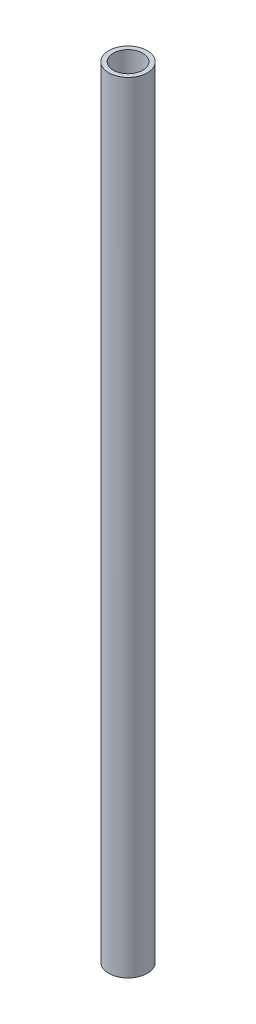
ISO-10303-21;
HEADER;
FILE_DESCRIPTION(('STEP AP214'),'2;1');
FILE_NAME('part.step','',(''),(''),'','','');
FILE_SCHEMA(('AUTOMOTIVE_DESIGN { 1 0 10303 214 1 1 1 1 }'));
ENDSEC;
DATA;
#1=APPLICATION_CONTEXT('core data for automotive mechanical design processes');
#2=APPLICATION_PROTOCOL_DEFINITION('international standard','automotive_design',2000,#1);
#3=PRODUCT_CONTEXT('',#1,'mechanical');
#4=PRODUCT('Part','Part','',(#3));
#5=PRODUCT_RELATED_PRODUCT_CATEGORY('part','',(#4));
#6=PRODUCT_DEFINITION_FORMATION('','',#4);
#7=PRODUCT_DEFINITION_CONTEXT('part definition',#1,'design');
#8=PRODUCT_DEFINITION('design','',#6,#7);
#9=PRODUCT_DEFINITION_SHAPE('','',#8);
#10=(LENGTH_UNIT() NAMED_UNIT(*) SI_UNIT(.MILLI.,.METRE.));
#11=(NAMED_UNIT(*) PLANE_ANGLE_UNIT() SI_UNIT($,.RADIAN.));
#12=(NAMED_UNIT(*) SI_UNIT($,.STERADIAN.) SOLID_ANGLE_UNIT());
#13=UNCERTAINTY_MEASURE_WITH_UNIT(LENGTH_MEASURE(1.E-05),#10,'distance_accuracy_value','');
#14=(GEOMETRIC_REPRESENTATION_CONTEXT(3) GLOBAL_UNCERTAINTY_ASSIGNED_CONTEXT((#13)) GLOBAL_UNIT_ASSIGNED_CONTEXT((#10,
#11,#12)) REPRESENTATION_CONTEXT('',''));
#15=CARTESIAN_POINT('',(0.,0.,0.));
#16=DIRECTION('',(0.,0.,1.));
#17=DIRECTION('',(1.,0.,0.));
#18=AXIS2_PLACEMENT_3D('',#15,#16,#17);
#19=CARTESIAN_POINT('',(-1.11286674320255E-13,128.579995791175,1.62832247685429E-13));
#20=DIRECTION('',(0.,-1.,0.));
#21=DIRECTION('',(0.589150160189619,0.,0.808023569426379));
#22=AXIS2_PLACEMENT_3D('',#19,#20,#21);
#23=PLANE('',#22);
#24=CARTESIAN_POINT('',(-1.11286674320255E-13,128.579995791175,1.62832247685429E-13));
#25=DIRECTION('',(0.,-1.,0.));
#26=DIRECTION('',(0.589150160189619,0.,0.808023569426379));
#27=AXIS2_PLACEMENT_3D('',#24,#25,#26);
#28=CIRCLE('',#27,4.8768);
#29=CARTESIAN_POINT('',(2.87316750121262,128.579995791175,3.94056934337873));
#30=VERTEX_POINT('',#29);
#31=EDGE_CURVE('E50',#30,#30,#28,.T.);
#32=ORIENTED_EDGE('',*,*,#31,.T.);
#33=EDGE_LOOP('',(#32));
#34=FACE_BOUND('',#33,.T.);
#35=CARTESIAN_POINT('',(0.,128.579995791175,0.));
#36=DIRECTION('',(0.,-1.,0.));
#37=DIRECTION('',(0.,0.,-1.));
#38=AXIS2_PLACEMENT_3D('',#35,#36,#37);
#39=CIRCLE('',#38,6.35);
#40=CARTESIAN_POINT('',(0.,128.579995791175,-6.35));
#41=VERTEX_POINT('',#40);
#42=EDGE_CURVE('E40',#41,#41,#39,.T.);
#43=ORIENTED_EDGE('',*,*,#42,.F.);
#44=EDGE_LOOP('',(#43));
#45=FACE_BOUND('',#44,.T.);
#46=ADVANCED_FACE('F36',(#34,#45),#23,.F.);
#47=CARTESIAN_POINT('',(0.,-128.579995791175,0.));
#48=DIRECTION('',(0.,1.,0.));
#49=DIRECTION('',(0.,0.,1.));
#50=AXIS2_PLACEMENT_3D('',#47,#48,#49);
#51=PLANE('',#50);
#52=CARTESIAN_POINT('',(0.,-128.579995791175,0.));
#53=DIRECTION('',(0.,1.,0.));
#54=DIRECTION('',(0.,0.,1.));
#55=AXIS2_PLACEMENT_3D('',#52,#53,#54);
#56=CIRCLE('',#55,4.8768);
#57=CARTESIAN_POINT('',(0.,-128.579995791175,4.8768));
#58=VERTEX_POINT('',#57);
#59=EDGE_CURVE('E44',#58,#58,#56,.T.);
#60=ORIENTED_EDGE('',*,*,#59,.T.);
#61=EDGE_LOOP('',(#60));
#62=FACE_BOUND('',#61,.T.);
#63=CARTESIAN_POINT('',(0.,-128.579995791175,0.));
#64=DIRECTION('',(0.,1.,0.));
#65=DIRECTION('',(0.,0.,1.));
#66=AXIS2_PLACEMENT_3D('',#63,#64,#65);
#67=CIRCLE('',#66,6.35);
#68=CARTESIAN_POINT('',(0.,-128.579995791175,6.35));
#69=VERTEX_POINT('',#68);
#70=EDGE_CURVE('E11',#69,#69,#67,.T.);
#71=ORIENTED_EDGE('',*,*,#70,.F.);
#72=EDGE_LOOP('',(#71));
#73=FACE_BOUND('',#72,.T.);
#74=ADVANCED_FACE('F60',(#62,#73),#51,.F.);
#75=CARTESIAN_POINT('',(0.,134.931995791175,0.));
#76=DIRECTION('',(0.,-1.,0.));
#77=DIRECTION('',(0.,0.,-1.));
#78=AXIS2_PLACEMENT_3D('',#75,#76,#77);
#79=CYLINDRICAL_SURFACE('',#78,6.35);
#80=ORIENTED_EDGE('',*,*,#42,.T.);
#81=EDGE_LOOP('',(#80));
#82=FACE_BOUND('',#81,.T.);
#83=ORIENTED_EDGE('',*,*,#70,.T.);
#84=EDGE_LOOP('',(#83));
#85=FACE_BOUND('',#84,.T.);
#86=ADVANCED_FACE('F57',(#82,#85),#79,.T.);
#87=CARTESIAN_POINT('',(0.,134.931995791175,0.));
#88=DIRECTION('',(0.,-1.,0.));
#89=DIRECTION('',(0.,0.,-1.));
#90=AXIS2_PLACEMENT_3D('',#87,#88,#89);
#91=CYLINDRICAL_SURFACE('',#90,4.8768);
#92=ORIENTED_EDGE('',*,*,#31,.F.);
#93=EDGE_LOOP('',(#92));
#94=FACE_BOUND('',#93,.T.);
#95=ORIENTED_EDGE('',*,*,#59,.F.);
#96=EDGE_LOOP('',(#95));
#97=FACE_BOUND('',#96,.T.);
#98=ADVANCED_FACE('F38',(#94,#97),#91,.F.);
#99=CLOSED_SHELL('',(#46,#74,#86,#98));
#100=MANIFOLD_SOLID_BREP('B2',#99);
#101=ADVANCED_BREP_SHAPE_REPRESENTATION('',(#18,#100),#14);
#102=SHAPE_DEFINITION_REPRESENTATION(#9,#101);
ENDSEC;
END-ISO-10303-21;
